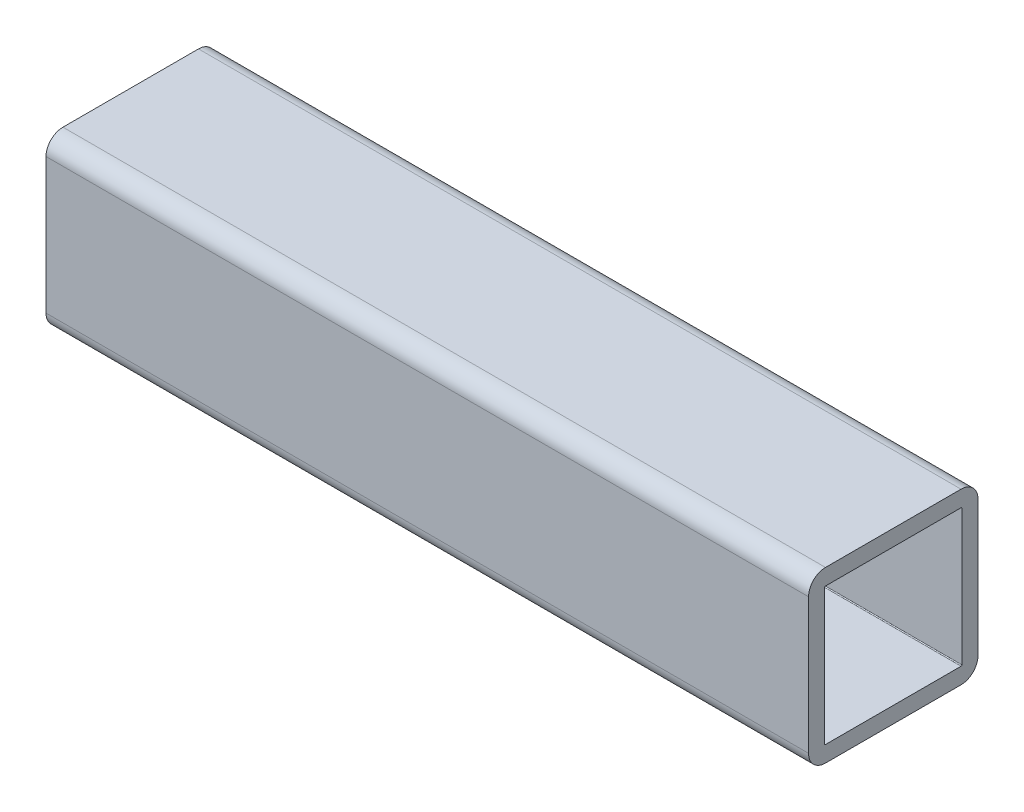
ISO-10303-21;
HEADER;
FILE_DESCRIPTION(('STEP AP214'),'2;1');
FILE_NAME('part.step','',(''),(''),'','','');
FILE_SCHEMA(('AUTOMOTIVE_DESIGN { 1 0 10303 214 1 1 1 1 }'));
ENDSEC;
DATA;
#1=APPLICATION_CONTEXT('core data for automotive mechanical design processes');
#2=APPLICATION_PROTOCOL_DEFINITION('international standard','automotive_design',2000,#1);
#3=PRODUCT_CONTEXT('',#1,'mechanical');
#4=PRODUCT('Part','Part','',(#3));
#5=PRODUCT_RELATED_PRODUCT_CATEGORY('part','',(#4));
#6=PRODUCT_DEFINITION_FORMATION('','',#4);
#7=PRODUCT_DEFINITION_CONTEXT('part definition',#1,'design');
#8=PRODUCT_DEFINITION('design','',#6,#7);
#9=PRODUCT_DEFINITION_SHAPE('','',#8);
#10=(LENGTH_UNIT() NAMED_UNIT(*) SI_UNIT(.MILLI.,.METRE.));
#11=(NAMED_UNIT(*) PLANE_ANGLE_UNIT() SI_UNIT($,.RADIAN.));
#12=(NAMED_UNIT(*) SI_UNIT($,.STERADIAN.) SOLID_ANGLE_UNIT());
#13=UNCERTAINTY_MEASURE_WITH_UNIT(LENGTH_MEASURE(1.E-05),#10,'distance_accuracy_value','');
#14=(GEOMETRIC_REPRESENTATION_CONTEXT(3) GLOBAL_UNCERTAINTY_ASSIGNED_CONTEXT((#13)) GLOBAL_UNIT_ASSIGNED_CONTEXT((#10,
#11,#12)) REPRESENTATION_CONTEXT('',''));
#15=CARTESIAN_POINT('',(0.,0.,0.));
#16=DIRECTION('',(0.,0.,1.));
#17=DIRECTION('',(1.,0.,0.));
#18=AXIS2_PLACEMENT_3D('',#15,#16,#17);
#19=CARTESIAN_POINT('',(114.3,10.16,10.16));
#20=DIRECTION('',(-1.,0.,0.));
#21=DIRECTION('',(0.,0.,1.));
#22=AXIS2_PLACEMENT_3D('',#19,#20,#21);
#23=CYLINDRICAL_SURFACE('',#22,2.54);
#24=CARTESIAN_POINT('',(0.,10.16,10.16));
#25=DIRECTION('',(1.,0.,0.));
#26=DIRECTION('',(0.,0.,-1.));
#27=AXIS2_PLACEMENT_3D('',#24,#25,#26);
#28=CIRCLE('',#27,2.54);
#29=CARTESIAN_POINT('',(0.,12.7,10.16));
#30=VERTEX_POINT('',#29);
#31=CARTESIAN_POINT('',(0.,10.16,12.7));
#32=VERTEX_POINT('',#31);
#33=EDGE_CURVE('E233',#30,#32,#28,.T.);
#34=ORIENTED_EDGE('',*,*,#33,.T.);
#35=DIRECTION('',(-1.,0.,0.));
#36=VECTOR('',#35,1.);
#37=CARTESIAN_POINT('',(114.3,10.16,12.7));
#38=LINE('',#37,#36);
#39=CARTESIAN_POINT('',(114.3,10.16,12.7));
#40=VERTEX_POINT('',#39);
#41=EDGE_CURVE('E12',#40,#32,#38,.T.);
#42=ORIENTED_EDGE('',*,*,#41,.F.);
#43=CARTESIAN_POINT('',(114.3,10.16,10.16));
#44=DIRECTION('',(1.,0.,0.));
#45=DIRECTION('',(0.,0.,-1.));
#46=AXIS2_PLACEMENT_3D('',#43,#44,#45);
#47=CIRCLE('',#46,2.54);
#48=CARTESIAN_POINT('',(114.3,12.7,10.16));
#49=VERTEX_POINT('',#48);
#50=EDGE_CURVE('E311',#49,#40,#47,.T.);
#51=ORIENTED_EDGE('',*,*,#50,.F.);
#52=DIRECTION('',(-1.,0.,0.));
#53=VECTOR('',#52,1.);
#54=CARTESIAN_POINT('',(114.3,12.7,10.16));
#55=LINE('',#54,#53);
#56=EDGE_CURVE('E248',#49,#30,#55,.T.);
#57=ORIENTED_EDGE('',*,*,#56,.T.);
#58=EDGE_LOOP('',(#34,#42,#51,#57));
#59=FACE_BOUND('',#58,.T.);
#60=ADVANCED_FACE('F61',(#59),#23,.T.);
#61=CARTESIAN_POINT('',(114.3,10.16,12.7));
#62=DIRECTION('',(0.,0.,-1.));
#63=DIRECTION('',(-1.,0.,0.));
#64=AXIS2_PLACEMENT_3D('',#61,#62,#63);
#65=PLANE('',#64);
#66=DIRECTION('',(0.,-1.,0.));
#67=VECTOR('',#66,1.);
#68=CARTESIAN_POINT('',(0.,10.16,12.7));
#69=LINE('',#68,#67);
#70=CARTESIAN_POINT('',(0.,-10.16,12.7));
#71=VERTEX_POINT('',#70);
#72=EDGE_CURVE('E236',#32,#71,#69,.T.);
#73=ORIENTED_EDGE('',*,*,#72,.T.);
#74=DIRECTION('',(-1.,0.,0.));
#75=VECTOR('',#74,1.);
#76=CARTESIAN_POINT('',(114.3,-10.16,12.7));
#77=LINE('',#76,#75);
#78=CARTESIAN_POINT('',(114.3,-10.16,12.7));
#79=VERTEX_POINT('',#78);
#80=EDGE_CURVE('E71',#79,#71,#77,.T.);
#81=ORIENTED_EDGE('',*,*,#80,.F.);
#82=DIRECTION('',(0.,-1.,0.));
#83=VECTOR('',#82,1.);
#84=CARTESIAN_POINT('',(114.3,10.16,12.7));
#85=LINE('',#84,#83);
#86=EDGE_CURVE('E313',#40,#79,#85,.T.);
#87=ORIENTED_EDGE('',*,*,#86,.F.);
#88=ORIENTED_EDGE('',*,*,#41,.T.);
#89=EDGE_LOOP('',(#73,#81,#87,#88));
#90=FACE_BOUND('',#89,.T.);
#91=ADVANCED_FACE('F348',(#90),#65,.F.);
#92=CARTESIAN_POINT('',(114.3,-10.16,10.16));
#93=DIRECTION('',(-1.,0.,0.));
#94=DIRECTION('',(0.,0.,1.));
#95=AXIS2_PLACEMENT_3D('',#92,#93,#94);
#96=CYLINDRICAL_SURFACE('',#95,2.54);
#97=CARTESIAN_POINT('',(0.,-10.16,10.16));
#98=DIRECTION('',(1.,0.,0.));
#99=DIRECTION('',(0.,0.,-1.));
#100=AXIS2_PLACEMENT_3D('',#97,#98,#99);
#101=CIRCLE('',#100,2.54);
#102=CARTESIAN_POINT('',(0.,-12.7,10.16));
#103=VERTEX_POINT('',#102);
#104=EDGE_CURVE('E238',#71,#103,#101,.T.);
#105=ORIENTED_EDGE('',*,*,#104,.T.);
#106=DIRECTION('',(-1.,0.,0.));
#107=VECTOR('',#106,1.);
#108=CARTESIAN_POINT('',(114.3,-12.7,10.16));
#109=LINE('',#108,#107);
#110=CARTESIAN_POINT('',(114.3,-12.7,10.16));
#111=VERTEX_POINT('',#110);
#112=EDGE_CURVE('E255',#111,#103,#109,.T.);
#113=ORIENTED_EDGE('',*,*,#112,.F.);
#114=CARTESIAN_POINT('',(114.3,-10.16,10.16));
#115=DIRECTION('',(1.,0.,0.));
#116=DIRECTION('',(0.,0.,-1.));
#117=AXIS2_PLACEMENT_3D('',#114,#115,#116);
#118=CIRCLE('',#117,2.54);
#119=EDGE_CURVE('E315',#79,#111,#118,.T.);
#120=ORIENTED_EDGE('',*,*,#119,.F.);
#121=ORIENTED_EDGE('',*,*,#80,.T.);
#122=EDGE_LOOP('',(#105,#113,#120,#121));
#123=FACE_BOUND('',#122,.T.);
#124=ADVANCED_FACE('F353',(#123),#96,.T.);
#125=CARTESIAN_POINT('',(114.3,-12.7,-10.16));
#126=DIRECTION('',(0.,1.,0.));
#127=DIRECTION('',(0.,0.,1.));
#128=AXIS2_PLACEMENT_3D('',#125,#126,#127);
#129=PLANE('',#128);
#130=DIRECTION('',(0.,0.,-1.));
#131=VECTOR('',#130,1.);
#132=CARTESIAN_POINT('',(0.,-12.7,-10.16));
#133=LINE('',#132,#131);
#134=CARTESIAN_POINT('',(0.,-12.7,-10.16));
#135=VERTEX_POINT('',#134);
#136=EDGE_CURVE('E240',#103,#135,#133,.T.);
#137=ORIENTED_EDGE('',*,*,#136,.T.);
#138=DIRECTION('',(-1.,0.,0.));
#139=VECTOR('',#138,1.);
#140=CARTESIAN_POINT('',(114.3,-12.7,-10.16));
#141=LINE('',#140,#139);
#142=CARTESIAN_POINT('',(114.3,-12.7,-10.16));
#143=VERTEX_POINT('',#142);
#144=EDGE_CURVE('E252',#143,#135,#141,.T.);
#145=ORIENTED_EDGE('',*,*,#144,.F.);
#146=DIRECTION('',(0.,0.,-1.));
#147=VECTOR('',#146,1.);
#148=CARTESIAN_POINT('',(114.3,-12.7,-10.16));
#149=LINE('',#148,#147);
#150=EDGE_CURVE('E317',#111,#143,#149,.T.);
#151=ORIENTED_EDGE('',*,*,#150,.F.);
#152=ORIENTED_EDGE('',*,*,#112,.T.);
#153=EDGE_LOOP('',(#137,#145,#151,#152));
#154=FACE_BOUND('',#153,.T.);
#155=ADVANCED_FACE('F323',(#154),#129,.F.);
#156=CARTESIAN_POINT('',(114.3,-10.16,-10.16));
#157=DIRECTION('',(-1.,0.,0.));
#158=DIRECTION('',(0.,0.,1.));
#159=AXIS2_PLACEMENT_3D('',#156,#157,#158);
#160=CYLINDRICAL_SURFACE('',#159,2.54);
#161=CARTESIAN_POINT('',(0.,-10.16,-10.16));
#162=DIRECTION('',(1.,0.,0.));
#163=DIRECTION('',(0.,0.,-1.));
#164=AXIS2_PLACEMENT_3D('',#161,#162,#163);
#165=CIRCLE('',#164,2.54);
#166=CARTESIAN_POINT('',(0.,-10.16,-12.7));
#167=VERTEX_POINT('',#166);
#168=EDGE_CURVE('E242',#135,#167,#165,.T.);
#169=ORIENTED_EDGE('',*,*,#168,.T.);
#170=DIRECTION('',(-1.,0.,0.));
#171=VECTOR('',#170,1.);
#172=CARTESIAN_POINT('',(114.3,-10.16,-12.7));
#173=LINE('',#172,#171);
#174=CARTESIAN_POINT('',(114.3,-10.16,-12.7));
#175=VERTEX_POINT('',#174);
#176=EDGE_CURVE('E200',#175,#167,#173,.T.);
#177=ORIENTED_EDGE('',*,*,#176,.F.);
#178=CARTESIAN_POINT('',(114.3,-10.16,-10.16));
#179=DIRECTION('',(1.,0.,0.));
#180=DIRECTION('',(0.,0.,-1.));
#181=AXIS2_PLACEMENT_3D('',#178,#179,#180);
#182=CIRCLE('',#181,2.54);
#183=EDGE_CURVE('E191',#143,#175,#182,.T.);
#184=ORIENTED_EDGE('',*,*,#183,.F.);
#185=ORIENTED_EDGE('',*,*,#144,.T.);
#186=EDGE_LOOP('',(#169,#177,#184,#185));
#187=FACE_BOUND('',#186,.T.);
#188=ADVANCED_FACE('F327',(#187),#160,.T.);
#189=CARTESIAN_POINT('',(114.3,-10.16,-12.7));
#190=DIRECTION('',(0.,0.,1.));
#191=DIRECTION('',(1.,0.,0.));
#192=AXIS2_PLACEMENT_3D('',#189,#190,#191);
#193=PLANE('',#192);
#194=DIRECTION('',(0.,1.,0.));
#195=VECTOR('',#194,1.);
#196=CARTESIAN_POINT('',(0.,-10.16,-12.7));
#197=LINE('',#196,#195);
#198=CARTESIAN_POINT('',(0.,10.16,-12.7));
#199=VERTEX_POINT('',#198);
#200=EDGE_CURVE('E199',#167,#199,#197,.T.);
#201=ORIENTED_EDGE('',*,*,#200,.T.);
#202=DIRECTION('',(-1.,0.,0.));
#203=VECTOR('',#202,1.);
#204=CARTESIAN_POINT('',(114.3,10.16,-12.7));
#205=LINE('',#204,#203);
#206=CARTESIAN_POINT('',(114.3,10.16,-12.7));
#207=VERTEX_POINT('',#206);
#208=EDGE_CURVE('E196',#207,#199,#205,.T.);
#209=ORIENTED_EDGE('',*,*,#208,.F.);
#210=DIRECTION('',(0.,1.,0.));
#211=VECTOR('',#210,1.);
#212=CARTESIAN_POINT('',(114.3,-10.16,-12.7));
#213=LINE('',#212,#211);
#214=EDGE_CURVE('E185',#175,#207,#213,.T.);
#215=ORIENTED_EDGE('',*,*,#214,.F.);
#216=ORIENTED_EDGE('',*,*,#176,.T.);
#217=EDGE_LOOP('',(#201,#209,#215,#216));
#218=FACE_BOUND('',#217,.T.);
#219=ADVANCED_FACE('F197',(#218),#193,.F.);
#220=CARTESIAN_POINT('',(114.3,10.16,-10.16));
#221=DIRECTION('',(-1.,0.,0.));
#222=DIRECTION('',(0.,0.,1.));
#223=AXIS2_PLACEMENT_3D('',#220,#221,#222);
#224=CYLINDRICAL_SURFACE('',#223,2.54);
#225=CARTESIAN_POINT('',(0.,10.16,-10.16));
#226=DIRECTION('',(1.,0.,0.));
#227=DIRECTION('',(0.,0.,-1.));
#228=AXIS2_PLACEMENT_3D('',#225,#226,#227);
#229=CIRCLE('',#228,2.54);
#230=CARTESIAN_POINT('',(0.,12.7,-10.16));
#231=VERTEX_POINT('',#230);
#232=EDGE_CURVE('E133',#199,#231,#229,.T.);
#233=ORIENTED_EDGE('',*,*,#232,.T.);
#234=DIRECTION('',(-1.,0.,0.));
#235=VECTOR('',#234,1.);
#236=CARTESIAN_POINT('',(114.3,12.7,-10.16));
#237=LINE('',#236,#235);
#238=CARTESIAN_POINT('',(114.3,12.7,-10.16));
#239=VERTEX_POINT('',#238);
#240=EDGE_CURVE('E201',#239,#231,#237,.T.);
#241=ORIENTED_EDGE('',*,*,#240,.F.);
#242=CARTESIAN_POINT('',(114.3,10.16,-10.16));
#243=DIRECTION('',(1.,0.,0.));
#244=DIRECTION('',(0.,0.,-1.));
#245=AXIS2_PLACEMENT_3D('',#242,#243,#244);
#246=CIRCLE('',#245,2.54);
#247=EDGE_CURVE('E189',#207,#239,#246,.T.);
#248=ORIENTED_EDGE('',*,*,#247,.F.);
#249=ORIENTED_EDGE('',*,*,#208,.T.);
#250=EDGE_LOOP('',(#233,#241,#248,#249));
#251=FACE_BOUND('',#250,.T.);
#252=ADVANCED_FACE('F203',(#251),#224,.T.);
#253=CARTESIAN_POINT('',(114.3,-10.16,10.16));
#254=DIRECTION('',(-1.,0.,0.));
#255=DIRECTION('',(0.,0.,1.));
#256=AXIS2_PLACEMENT_3D('',#253,#254,#255);
#257=CYLINDRICAL_SURFACE('',#256,0.127000000000002);
#258=CARTESIAN_POINT('',(0.,-10.16,10.16));
#259=DIRECTION('',(1.,0.,0.));
#260=DIRECTION('',(0.,0.,-1.));
#261=AXIS2_PLACEMENT_3D('',#258,#259,#260);
#262=CIRCLE('',#261,0.127000000000002);
#263=CARTESIAN_POINT('',(0.,-10.16,10.287));
#264=VERTEX_POINT('',#263);
#265=CARTESIAN_POINT('',(0.,-10.287,10.16));
#266=VERTEX_POINT('',#265);
#267=EDGE_CURVE('E209',#264,#266,#262,.T.);
#268=ORIENTED_EDGE('',*,*,#267,.F.);
#269=DIRECTION('',(-1.,0.,0.));
#270=VECTOR('',#269,1.);
#271=CARTESIAN_POINT('',(114.3,-10.16,10.287));
#272=LINE('',#271,#270);
#273=CARTESIAN_POINT('',(114.3,-10.16,10.287));
#274=VERTEX_POINT('',#273);
#275=EDGE_CURVE('E65',#274,#264,#272,.T.);
#276=ORIENTED_EDGE('',*,*,#275,.F.);
#277=CARTESIAN_POINT('',(114.3,-10.16,10.16));
#278=DIRECTION('',(1.,0.,0.));
#279=DIRECTION('',(0.,0.,-1.));
#280=AXIS2_PLACEMENT_3D('',#277,#278,#279);
#281=CIRCLE('',#280,0.127000000000002);
#282=CARTESIAN_POINT('',(114.3,-10.287,10.16));
#283=VERTEX_POINT('',#282);
#284=EDGE_CURVE('E247',#274,#283,#281,.T.);
#285=ORIENTED_EDGE('',*,*,#284,.T.);
#286=DIRECTION('',(-1.,0.,0.));
#287=VECTOR('',#286,1.);
#288=CARTESIAN_POINT('',(114.3,-10.287,10.16));
#289=LINE('',#288,#287);
#290=EDGE_CURVE('E205',#283,#266,#289,.T.);
#291=ORIENTED_EDGE('',*,*,#290,.T.);
#292=EDGE_LOOP('',(#268,#276,#285,#291));
#293=FACE_BOUND('',#292,.T.);
#294=ADVANCED_FACE('F63',(#293),#257,.F.);
#295=CARTESIAN_POINT('',(114.3,10.16,10.287));
#296=DIRECTION('',(0.,0.,-1.));
#297=DIRECTION('',(-1.,0.,0.));
#298=AXIS2_PLACEMENT_3D('',#295,#296,#297);
#299=PLANE('',#298);
#300=DIRECTION('',(0.,-1.,0.));
#301=VECTOR('',#300,1.);
#302=CARTESIAN_POINT('',(0.,10.16,10.287));
#303=LINE('',#302,#301);
#304=CARTESIAN_POINT('',(0.,10.16,10.287));
#305=VERTEX_POINT('',#304);
#306=EDGE_CURVE('E212',#305,#264,#303,.T.);
#307=ORIENTED_EDGE('',*,*,#306,.F.);
#308=DIRECTION('',(-1.,0.,0.));
#309=VECTOR('',#308,1.);
#310=CARTESIAN_POINT('',(114.3,10.16,10.287));
#311=LINE('',#310,#309);
#312=CARTESIAN_POINT('',(114.3,10.16,10.287));
#313=VERTEX_POINT('',#312);
#314=EDGE_CURVE('E270',#313,#305,#311,.T.);
#315=ORIENTED_EDGE('',*,*,#314,.F.);
#316=DIRECTION('',(0.,-1.,0.));
#317=VECTOR('',#316,1.);
#318=CARTESIAN_POINT('',(114.3,10.16,10.287));
#319=LINE('',#318,#317);
#320=EDGE_CURVE('E279',#313,#274,#319,.T.);
#321=ORIENTED_EDGE('',*,*,#320,.T.);
#322=ORIENTED_EDGE('',*,*,#275,.T.);
#323=EDGE_LOOP('',(#307,#315,#321,#322));
#324=FACE_BOUND('',#323,.T.);
#325=ADVANCED_FACE('F277',(#324),#299,.T.);
#326=CARTESIAN_POINT('',(114.3,10.16,10.16));
#327=DIRECTION('',(-1.,0.,0.));
#328=DIRECTION('',(0.,0.,1.));
#329=AXIS2_PLACEMENT_3D('',#326,#327,#328);
#330=CYLINDRICAL_SURFACE('',#329,0.127000000000002);
#331=CARTESIAN_POINT('',(0.,10.16,10.16));
#332=DIRECTION('',(1.,0.,0.));
#333=DIRECTION('',(0.,0.,-1.));
#334=AXIS2_PLACEMENT_3D('',#331,#332,#333);
#335=CIRCLE('',#334,0.127000000000002);
#336=CARTESIAN_POINT('',(0.,10.287,10.16));
#337=VERTEX_POINT('',#336);
#338=EDGE_CURVE('E215',#337,#305,#335,.T.);
#339=ORIENTED_EDGE('',*,*,#338,.F.);
#340=DIRECTION('',(-1.,0.,0.));
#341=VECTOR('',#340,1.);
#342=CARTESIAN_POINT('',(114.3,10.287,10.16));
#343=LINE('',#342,#341);
#344=CARTESIAN_POINT('',(114.3,10.287,10.16));
#345=VERTEX_POINT('',#344);
#346=EDGE_CURVE('E269',#345,#337,#343,.T.);
#347=ORIENTED_EDGE('',*,*,#346,.F.);
#348=CARTESIAN_POINT('',(114.3,10.16,10.16));
#349=DIRECTION('',(1.,0.,0.));
#350=DIRECTION('',(0.,0.,-1.));
#351=AXIS2_PLACEMENT_3D('',#348,#349,#350);
#352=CIRCLE('',#351,0.127000000000002);
#353=EDGE_CURVE('E287',#345,#313,#352,.T.);
#354=ORIENTED_EDGE('',*,*,#353,.T.);
#355=ORIENTED_EDGE('',*,*,#314,.T.);
#356=EDGE_LOOP('',(#339,#347,#354,#355));
#357=FACE_BOUND('',#356,.T.);
#358=ADVANCED_FACE('F285',(#357),#330,.F.);
#359=CARTESIAN_POINT('',(114.3,10.287,10.16));
#360=DIRECTION('',(0.,-1.,0.));
#361=DIRECTION('',(0.,0.,-1.));
#362=AXIS2_PLACEMENT_3D('',#359,#360,#361);
#363=PLANE('',#362);
#364=DIRECTION('',(0.,0.,1.));
#365=VECTOR('',#364,1.);
#366=CARTESIAN_POINT('',(0.,10.287,10.16));
#367=LINE('',#366,#365);
#368=CARTESIAN_POINT('',(0.,10.287,-10.16));
#369=VERTEX_POINT('',#368);
#370=EDGE_CURVE('E218',#369,#337,#367,.T.);
#371=ORIENTED_EDGE('',*,*,#370,.F.);
#372=DIRECTION('',(-1.,0.,0.));
#373=VECTOR('',#372,1.);
#374=CARTESIAN_POINT('',(114.3,10.287,-10.16));
#375=LINE('',#374,#373);
#376=CARTESIAN_POINT('',(114.3,10.287,-10.16));
#377=VERTEX_POINT('',#376);
#378=EDGE_CURVE('E267',#377,#369,#375,.T.);
#379=ORIENTED_EDGE('',*,*,#378,.F.);
#380=DIRECTION('',(0.,0.,1.));
#381=VECTOR('',#380,1.);
#382=CARTESIAN_POINT('',(114.3,10.287,10.16));
#383=LINE('',#382,#381);
#384=EDGE_CURVE('E293',#377,#345,#383,.T.);
#385=ORIENTED_EDGE('',*,*,#384,.T.);
#386=ORIENTED_EDGE('',*,*,#346,.T.);
#387=EDGE_LOOP('',(#371,#379,#385,#386));
#388=FACE_BOUND('',#387,.T.);
#389=ADVANCED_FACE('F296',(#388),#363,.T.);
#390=CARTESIAN_POINT('',(114.3,10.16,-10.16));
#391=DIRECTION('',(-1.,0.,0.));
#392=DIRECTION('',(0.,0.,1.));
#393=AXIS2_PLACEMENT_3D('',#390,#391,#392);
#394=CYLINDRICAL_SURFACE('',#393,0.127000000000002);
#395=CARTESIAN_POINT('',(0.,10.16,-10.16));
#396=DIRECTION('',(1.,0.,0.));
#397=DIRECTION('',(0.,0.,-1.));
#398=AXIS2_PLACEMENT_3D('',#395,#396,#397);
#399=CIRCLE('',#398,0.127000000000002);
#400=CARTESIAN_POINT('',(0.,10.16,-10.287));
#401=VERTEX_POINT('',#400);
#402=EDGE_CURVE('E221',#401,#369,#399,.T.);
#403=ORIENTED_EDGE('',*,*,#402,.F.);
#404=DIRECTION('',(-1.,0.,0.));
#405=VECTOR('',#404,1.);
#406=CARTESIAN_POINT('',(114.3,10.16,-10.287));
#407=LINE('',#406,#405);
#408=CARTESIAN_POINT('',(114.3,10.16,-10.287));
#409=VERTEX_POINT('',#408);
#410=EDGE_CURVE('E265',#409,#401,#407,.T.);
#411=ORIENTED_EDGE('',*,*,#410,.F.);
#412=CARTESIAN_POINT('',(114.3,10.16,-10.16));
#413=DIRECTION('',(1.,0.,0.));
#414=DIRECTION('',(0.,0.,-1.));
#415=AXIS2_PLACEMENT_3D('',#412,#413,#414);
#416=CIRCLE('',#415,0.127000000000002);
#417=EDGE_CURVE('E297',#409,#377,#416,.T.);
#418=ORIENTED_EDGE('',*,*,#417,.T.);
#419=ORIENTED_EDGE('',*,*,#378,.T.);
#420=EDGE_LOOP('',(#403,#411,#418,#419));
#421=FACE_BOUND('',#420,.T.);
#422=ADVANCED_FACE('F364',(#421),#394,.F.);
#423=CARTESIAN_POINT('',(114.3,-10.16,-10.287));
#424=DIRECTION('',(0.,0.,1.));
#425=DIRECTION('',(1.,0.,0.));
#426=AXIS2_PLACEMENT_3D('',#423,#424,#425);
#427=PLANE('',#426);
#428=DIRECTION('',(0.,1.,0.));
#429=VECTOR('',#428,1.);
#430=CARTESIAN_POINT('',(0.,-10.16,-10.287));
#431=LINE('',#430,#429);
#432=CARTESIAN_POINT('',(0.,-10.16,-10.287));
#433=VERTEX_POINT('',#432);
#434=EDGE_CURVE('E224',#433,#401,#431,.T.);
#435=ORIENTED_EDGE('',*,*,#434,.F.);
#436=DIRECTION('',(-1.,0.,0.));
#437=VECTOR('',#436,1.);
#438=CARTESIAN_POINT('',(114.3,-10.16,-10.287));
#439=LINE('',#438,#437);
#440=CARTESIAN_POINT('',(114.3,-10.16,-10.287));
#441=VERTEX_POINT('',#440);
#442=EDGE_CURVE('E263',#441,#433,#439,.T.);
#443=ORIENTED_EDGE('',*,*,#442,.F.);
#444=DIRECTION('',(0.,1.,0.));
#445=VECTOR('',#444,1.);
#446=CARTESIAN_POINT('',(114.3,-10.16,-10.287));
#447=LINE('',#446,#445);
#448=EDGE_CURVE('E299',#441,#409,#447,.T.);
#449=ORIENTED_EDGE('',*,*,#448,.T.);
#450=ORIENTED_EDGE('',*,*,#410,.T.);
#451=EDGE_LOOP('',(#435,#443,#449,#450));
#452=FACE_BOUND('',#451,.T.);
#453=ADVANCED_FACE('F360',(#452),#427,.T.);
#454=CARTESIAN_POINT('',(114.3,-10.16,-10.16));
#455=DIRECTION('',(-1.,0.,0.));
#456=DIRECTION('',(0.,0.,1.));
#457=AXIS2_PLACEMENT_3D('',#454,#455,#456);
#458=CYLINDRICAL_SURFACE('',#457,0.127000000000002);
#459=CARTESIAN_POINT('',(0.,-10.16,-10.16));
#460=DIRECTION('',(1.,0.,0.));
#461=DIRECTION('',(0.,0.,-1.));
#462=AXIS2_PLACEMENT_3D('',#459,#460,#461);
#463=CIRCLE('',#462,0.127000000000002);
#464=CARTESIAN_POINT('',(0.,-10.287,-10.16));
#465=VERTEX_POINT('',#464);
#466=EDGE_CURVE('E227',#465,#433,#463,.T.);
#467=ORIENTED_EDGE('',*,*,#466,.F.);
#468=DIRECTION('',(-1.,0.,0.));
#469=VECTOR('',#468,1.);
#470=CARTESIAN_POINT('',(114.3,-10.287,-10.16));
#471=LINE('',#470,#469);
#472=CARTESIAN_POINT('',(114.3,-10.287,-10.16));
#473=VERTEX_POINT('',#472);
#474=EDGE_CURVE('E261',#473,#465,#471,.T.);
#475=ORIENTED_EDGE('',*,*,#474,.F.);
#476=CARTESIAN_POINT('',(114.3,-10.16,-10.16));
#477=DIRECTION('',(1.,0.,0.));
#478=DIRECTION('',(0.,0.,-1.));
#479=AXIS2_PLACEMENT_3D('',#476,#477,#478);
#480=CIRCLE('',#479,0.127000000000002);
#481=EDGE_CURVE('E305',#473,#441,#480,.T.);
#482=ORIENTED_EDGE('',*,*,#481,.T.);
#483=ORIENTED_EDGE('',*,*,#442,.T.);
#484=EDGE_LOOP('',(#467,#475,#482,#483));
#485=FACE_BOUND('',#484,.T.);
#486=ADVANCED_FACE('F342',(#485),#458,.F.);
#487=CARTESIAN_POINT('',(114.3,-10.287,-10.16));
#488=DIRECTION('',(0.,1.,0.));
#489=DIRECTION('',(0.,0.,1.));
#490=AXIS2_PLACEMENT_3D('',#487,#488,#489);
#491=PLANE('',#490);
#492=DIRECTION('',(0.,0.,-1.));
#493=VECTOR('',#492,1.);
#494=CARTESIAN_POINT('',(0.,-10.287,-10.16));
#495=LINE('',#494,#493);
#496=EDGE_CURVE('E230',#266,#465,#495,.T.);
#497=ORIENTED_EDGE('',*,*,#496,.F.);
#498=ORIENTED_EDGE('',*,*,#290,.F.);
#499=DIRECTION('',(0.,0.,-1.));
#500=VECTOR('',#499,1.);
#501=CARTESIAN_POINT('',(114.3,-10.287,-10.16));
#502=LINE('',#501,#500);
#503=EDGE_CURVE('E308',#283,#473,#502,.T.);
#504=ORIENTED_EDGE('',*,*,#503,.T.);
#505=ORIENTED_EDGE('',*,*,#474,.T.);
#506=EDGE_LOOP('',(#497,#498,#504,#505));
#507=FACE_BOUND('',#506,.T.);
#508=ADVANCED_FACE('F335',(#507),#491,.T.);
#509=CARTESIAN_POINT('',(114.3,12.7,10.16));
#510=DIRECTION('',(0.,-1.,0.));
#511=DIRECTION('',(0.,0.,-1.));
#512=AXIS2_PLACEMENT_3D('',#509,#510,#511);
#513=PLANE('',#512);
#514=DIRECTION('',(0.,0.,1.));
#515=VECTOR('',#514,1.);
#516=CARTESIAN_POINT('',(0.,12.7,10.16));
#517=LINE('',#516,#515);
#518=EDGE_CURVE('E139',#231,#30,#517,.T.);
#519=ORIENTED_EDGE('',*,*,#518,.T.);
#520=ORIENTED_EDGE('',*,*,#56,.F.);
#521=DIRECTION('',(0.,0.,1.));
#522=VECTOR('',#521,1.);
#523=CARTESIAN_POINT('',(114.3,12.7,10.16));
#524=LINE('',#523,#522);
#525=EDGE_CURVE('E80',#239,#49,#524,.T.);
#526=ORIENTED_EDGE('',*,*,#525,.F.);
#527=ORIENTED_EDGE('',*,*,#240,.T.);
#528=EDGE_LOOP('',(#519,#520,#526,#527));
#529=FACE_BOUND('',#528,.T.);
#530=ADVANCED_FACE('F333',(#529),#513,.F.);
#531=CARTESIAN_POINT('',(114.3,10.16,10.16));
#532=DIRECTION('',(1.,0.,0.));
#533=DIRECTION('',(0.,0.,-1.));
#534=AXIS2_PLACEMENT_3D('',#531,#532,#533);
#535=PLANE('',#534);
#536=ORIENTED_EDGE('',*,*,#284,.F.);
#537=ORIENTED_EDGE('',*,*,#320,.F.);
#538=ORIENTED_EDGE('',*,*,#353,.F.);
#539=ORIENTED_EDGE('',*,*,#384,.F.);
#540=ORIENTED_EDGE('',*,*,#417,.F.);
#541=ORIENTED_EDGE('',*,*,#448,.F.);
#542=ORIENTED_EDGE('',*,*,#481,.F.);
#543=ORIENTED_EDGE('',*,*,#503,.F.);
#544=EDGE_LOOP('',(#536,#537,#538,#539,#540,#541,#542,#543));
#545=FACE_BOUND('',#544,.T.);
#546=ORIENTED_EDGE('',*,*,#50,.T.);
#547=ORIENTED_EDGE('',*,*,#86,.T.);
#548=ORIENTED_EDGE('',*,*,#119,.T.);
#549=ORIENTED_EDGE('',*,*,#150,.T.);
#550=ORIENTED_EDGE('',*,*,#183,.T.);
#551=ORIENTED_EDGE('',*,*,#214,.T.);
#552=ORIENTED_EDGE('',*,*,#247,.T.);
#553=ORIENTED_EDGE('',*,*,#525,.T.);
#554=EDGE_LOOP('',(#546,#547,#548,#549,#550,#551,#552,#553));
#555=FACE_BOUND('',#554,.T.);
#556=ADVANCED_FACE('F187',(#545,#555),#535,.T.);
#557=CARTESIAN_POINT('',(0.,10.16,10.16));
#558=DIRECTION('',(1.,0.,0.));
#559=DIRECTION('',(0.,0.,-1.));
#560=AXIS2_PLACEMENT_3D('',#557,#558,#559);
#561=PLANE('',#560);
#562=ORIENTED_EDGE('',*,*,#267,.T.);
#563=ORIENTED_EDGE('',*,*,#496,.T.);
#564=ORIENTED_EDGE('',*,*,#466,.T.);
#565=ORIENTED_EDGE('',*,*,#434,.T.);
#566=ORIENTED_EDGE('',*,*,#402,.T.);
#567=ORIENTED_EDGE('',*,*,#370,.T.);
#568=ORIENTED_EDGE('',*,*,#338,.T.);
#569=ORIENTED_EDGE('',*,*,#306,.T.);
#570=EDGE_LOOP('',(#562,#563,#564,#565,#566,#567,#568,#569));
#571=FACE_BOUND('',#570,.T.);
#572=ORIENTED_EDGE('',*,*,#33,.F.);
#573=ORIENTED_EDGE('',*,*,#518,.F.);
#574=ORIENTED_EDGE('',*,*,#232,.F.);
#575=ORIENTED_EDGE('',*,*,#200,.F.);
#576=ORIENTED_EDGE('',*,*,#168,.F.);
#577=ORIENTED_EDGE('',*,*,#136,.F.);
#578=ORIENTED_EDGE('',*,*,#104,.F.);
#579=ORIENTED_EDGE('',*,*,#72,.F.);
#580=EDGE_LOOP('',(#572,#573,#574,#575,#576,#577,#578,#579));
#581=FACE_BOUND('',#580,.T.);
#582=ADVANCED_FACE('F282',(#571,#581),#561,.F.);
#583=CLOSED_SHELL('',(#60,#91,#124,#155,#188,#219,#252,#294,#325,#358,#389,#422,#453,#486,#508,
#530,#556,#582));
#584=MANIFOLD_SOLID_BREP('B2',#583);
#585=ADVANCED_BREP_SHAPE_REPRESENTATION('',(#18,#584),#14);
#586=SHAPE_DEFINITION_REPRESENTATION(#9,#585);
ENDSEC;
END-ISO-10303-21;
